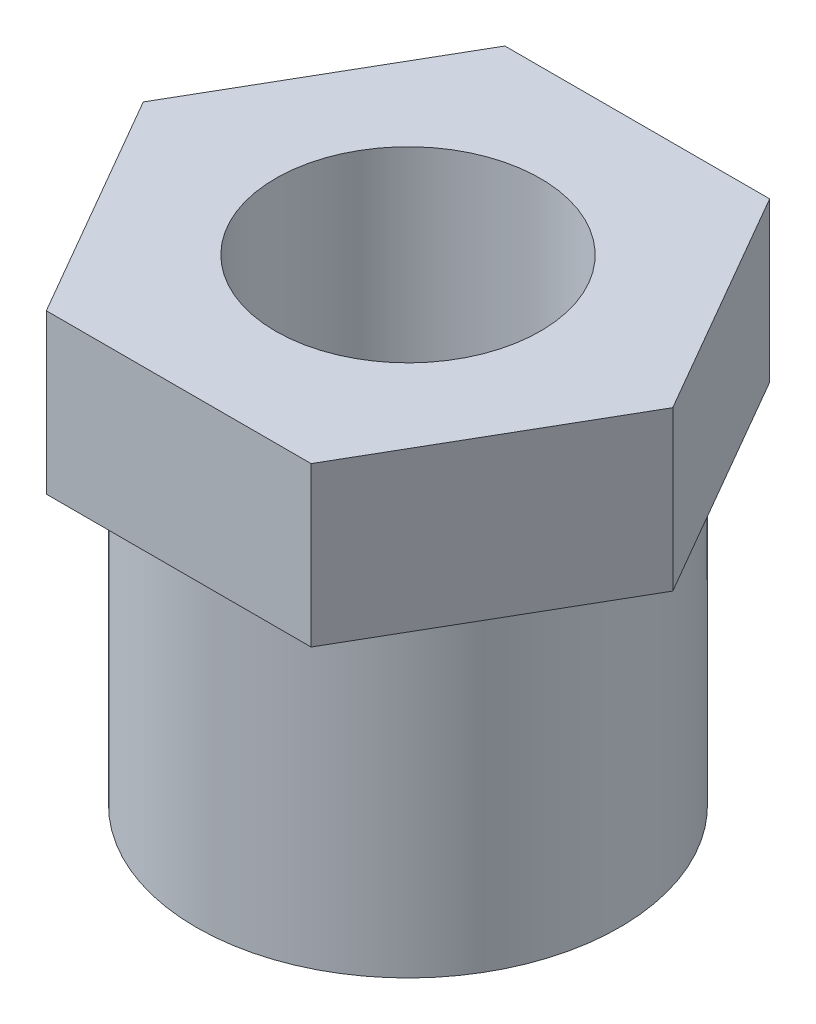
ISO-10303-21;
HEADER;
FILE_DESCRIPTION(('STEP AP214'),'2;1');
FILE_NAME('part.step','',(''),(''),'','','');
FILE_SCHEMA(('AUTOMOTIVE_DESIGN { 1 0 10303 214 1 1 1 1 }'));
ENDSEC;
DATA;
#1=APPLICATION_CONTEXT('core data for automotive mechanical design processes');
#2=APPLICATION_PROTOCOL_DEFINITION('international standard','automotive_design',2000,#1);
#3=PRODUCT_CONTEXT('',#1,'mechanical');
#4=PRODUCT('Part','Part','',(#3));
#5=PRODUCT_RELATED_PRODUCT_CATEGORY('part','',(#4));
#6=PRODUCT_DEFINITION_FORMATION('','',#4);
#7=PRODUCT_DEFINITION_CONTEXT('part definition',#1,'design');
#8=PRODUCT_DEFINITION('design','',#6,#7);
#9=PRODUCT_DEFINITION_SHAPE('','',#8);
#10=(LENGTH_UNIT() NAMED_UNIT(*) SI_UNIT(.MILLI.,.METRE.));
#11=(NAMED_UNIT(*) PLANE_ANGLE_UNIT() SI_UNIT($,.RADIAN.));
#12=(NAMED_UNIT(*) SI_UNIT($,.STERADIAN.) SOLID_ANGLE_UNIT());
#13=UNCERTAINTY_MEASURE_WITH_UNIT(LENGTH_MEASURE(1.E-05),#10,'distance_accuracy_value','');
#14=(GEOMETRIC_REPRESENTATION_CONTEXT(3) GLOBAL_UNCERTAINTY_ASSIGNED_CONTEXT((#13)) GLOBAL_UNIT_ASSIGNED_CONTEXT((#10,
#11,#12)) REPRESENTATION_CONTEXT('',''));
#15=CARTESIAN_POINT('',(0.,0.,0.));
#16=DIRECTION('',(0.,0.,1.));
#17=DIRECTION('',(1.,0.,0.));
#18=AXIS2_PLACEMENT_3D('',#15,#16,#17);
#19=CARTESIAN_POINT('',(0.,6.,0.));
#20=DIRECTION('',(0.,-1.,0.));
#21=DIRECTION('',(0.,0.,-1.));
#22=AXIS2_PLACEMENT_3D('',#19,#20,#21);
#23=CYLINDRICAL_SURFACE('',#22,4.);
#24=CARTESIAN_POINT('',(0.,6.,0.));
#25=DIRECTION('',(0.,1.,0.));
#26=DIRECTION('',(0.,0.,1.));
#27=AXIS2_PLACEMENT_3D('',#24,#25,#26);
#28=CIRCLE('',#27,4.);
#29=CARTESIAN_POINT('',(0.,6.,4.));
#30=VERTEX_POINT('',#29);
#31=EDGE_CURVE('E11',#30,#30,#28,.T.);
#32=ORIENTED_EDGE('',*,*,#31,.F.);
#33=EDGE_LOOP('',(#32));
#34=FACE_BOUND('',#33,.T.);
#35=CARTESIAN_POINT('',(0.,0.,0.));
#36=DIRECTION('',(0.,1.,0.));
#37=DIRECTION('',(0.,0.,1.));
#38=AXIS2_PLACEMENT_3D('',#35,#36,#37);
#39=CIRCLE('',#38,4.);
#40=CARTESIAN_POINT('',(0.,0.,4.));
#41=VERTEX_POINT('',#40);
#42=EDGE_CURVE('E40',#41,#41,#39,.T.);
#43=ORIENTED_EDGE('',*,*,#42,.T.);
#44=EDGE_LOOP('',(#43));
#45=FACE_BOUND('',#44,.T.);
#46=ADVANCED_FACE('F37',(#34,#45),#23,.T.);
#47=CARTESIAN_POINT('',(0.,0.,0.));
#48=DIRECTION('',(0.,1.,0.));
#49=DIRECTION('',(0.,0.,1.));
#50=AXIS2_PLACEMENT_3D('',#47,#48,#49);
#51=PLANE('',#50);
#52=CARTESIAN_POINT('',(0.,0.,0.));
#53=DIRECTION('',(0.,1.,0.));
#54=DIRECTION('',(0.,0.,1.));
#55=AXIS2_PLACEMENT_3D('',#52,#53,#54);
#56=CIRCLE('',#55,2.5);
#57=CARTESIAN_POINT('',(0.,0.,2.5));
#58=VERTEX_POINT('',#57);
#59=EDGE_CURVE('E126',#58,#58,#56,.T.);
#60=ORIENTED_EDGE('',*,*,#59,.T.);
#61=EDGE_LOOP('',(#60));
#62=FACE_BOUND('',#61,.T.);
#63=ORIENTED_EDGE('',*,*,#42,.F.);
#64=EDGE_LOOP('',(#63));
#65=FACE_BOUND('',#64,.T.);
#66=ADVANCED_FACE('F146',(#62,#65),#51,.F.);
#67=CARTESIAN_POINT('',(-2.5,9.,4.33012701892219));
#68=DIRECTION('',(0.,0.,-1.));
#69=DIRECTION('',(-1.,0.,0.));
#70=AXIS2_PLACEMENT_3D('',#67,#68,#69);
#71=PLANE('',#70);
#72=DIRECTION('',(1.,0.,0.));
#73=VECTOR('',#72,1.);
#74=CARTESIAN_POINT('',(-2.5,6.,4.33012701892219));
#75=LINE('',#74,#73);
#76=CARTESIAN_POINT('',(-2.5,6.,4.33012701892219));
#77=VERTEX_POINT('',#76);
#78=CARTESIAN_POINT('',(2.5,6.,4.33012701892219));
#79=VERTEX_POINT('',#78);
#80=EDGE_CURVE('E122',#77,#79,#75,.T.);
#81=ORIENTED_EDGE('',*,*,#80,.T.);
#82=DIRECTION('',(0.,-1.,0.));
#83=VECTOR('',#82,1.);
#84=CARTESIAN_POINT('',(2.5,9.,4.33012701892219));
#85=LINE('',#84,#83);
#86=CARTESIAN_POINT('',(2.5,9.,4.33012701892219));
#87=VERTEX_POINT('',#86);
#88=EDGE_CURVE('E140',#87,#79,#85,.T.);
#89=ORIENTED_EDGE('',*,*,#88,.F.);
#90=DIRECTION('',(1.,0.,0.));
#91=VECTOR('',#90,1.);
#92=CARTESIAN_POINT('',(-2.5,9.,4.33012701892219));
#93=LINE('',#92,#91);
#94=CARTESIAN_POINT('',(-2.5,9.,4.33012701892219));
#95=VERTEX_POINT('',#94);
#96=EDGE_CURVE('E133',#95,#87,#93,.T.);
#97=ORIENTED_EDGE('',*,*,#96,.F.);
#98=DIRECTION('',(0.,-1.,0.));
#99=VECTOR('',#98,1.);
#100=CARTESIAN_POINT('',(-2.5,9.,4.33012701892219));
#101=LINE('',#100,#99);
#102=EDGE_CURVE('E118',#95,#77,#101,.T.);
#103=ORIENTED_EDGE('',*,*,#102,.T.);
#104=EDGE_LOOP('',(#81,#89,#97,#103));
#105=FACE_BOUND('',#104,.T.);
#106=ADVANCED_FACE('F148',(#105),#71,.F.);
#107=CARTESIAN_POINT('',(2.5,9.,4.33012701892219));
#108=DIRECTION('',(-0.866025403784439,0.,-0.5));
#109=DIRECTION('',(-0.5,0.,0.866025403784439));
#110=AXIS2_PLACEMENT_3D('',#107,#108,#109);
#111=PLANE('',#110);
#112=DIRECTION('',(0.5,0.,-0.866025403784439));
#113=VECTOR('',#112,1.);
#114=CARTESIAN_POINT('',(2.5,6.,4.33012701892219));
#115=LINE('',#114,#113);
#116=CARTESIAN_POINT('',(5.,6.,0.));
#117=VERTEX_POINT('',#116);
#118=EDGE_CURVE('E125',#79,#117,#115,.T.);
#119=ORIENTED_EDGE('',*,*,#118,.T.);
#120=DIRECTION('',(0.,-1.,0.));
#121=VECTOR('',#120,1.);
#122=CARTESIAN_POINT('',(5.,9.,0.));
#123=LINE('',#122,#121);
#124=CARTESIAN_POINT('',(5.,9.,0.));
#125=VERTEX_POINT('',#124);
#126=EDGE_CURVE('E137',#125,#117,#123,.T.);
#127=ORIENTED_EDGE('',*,*,#126,.F.);
#128=DIRECTION('',(0.5,0.,-0.866025403784439));
#129=VECTOR('',#128,1.);
#130=CARTESIAN_POINT('',(2.5,9.,4.33012701892219));
#131=LINE('',#130,#129);
#132=EDGE_CURVE('E91',#87,#125,#131,.T.);
#133=ORIENTED_EDGE('',*,*,#132,.F.);
#134=ORIENTED_EDGE('',*,*,#88,.T.);
#135=EDGE_LOOP('',(#119,#127,#133,#134));
#136=FACE_BOUND('',#135,.T.);
#137=ADVANCED_FACE('F154',(#136),#111,.F.);
#138=CARTESIAN_POINT('',(5.,9.,0.));
#139=DIRECTION('',(-0.866025403784439,0.,0.5));
#140=DIRECTION('',(0.5,0.,0.866025403784439));
#141=AXIS2_PLACEMENT_3D('',#138,#139,#140);
#142=PLANE('',#141);
#143=DIRECTION('',(-0.5,0.,-0.866025403784438));
#144=VECTOR('',#143,1.);
#145=CARTESIAN_POINT('',(5.,6.,0.));
#146=LINE('',#145,#144);
#147=CARTESIAN_POINT('',(2.5,6.,-4.33012701892219));
#148=VERTEX_POINT('',#147);
#149=EDGE_CURVE('E128',#117,#148,#146,.T.);
#150=ORIENTED_EDGE('',*,*,#149,.T.);
#151=DIRECTION('',(0.,-1.,0.));
#152=VECTOR('',#151,1.);
#153=CARTESIAN_POINT('',(2.5,9.,-4.33012701892219));
#154=LINE('',#153,#152);
#155=CARTESIAN_POINT('',(2.5,9.,-4.33012701892219));
#156=VERTEX_POINT('',#155);
#157=EDGE_CURVE('E113',#156,#148,#154,.T.);
#158=ORIENTED_EDGE('',*,*,#157,.F.);
#159=DIRECTION('',(-0.5,0.,-0.866025403784438));
#160=VECTOR('',#159,1.);
#161=CARTESIAN_POINT('',(5.,9.,0.));
#162=LINE('',#161,#160);
#163=EDGE_CURVE('E104',#125,#156,#162,.T.);
#164=ORIENTED_EDGE('',*,*,#163,.F.);
#165=ORIENTED_EDGE('',*,*,#126,.T.);
#166=EDGE_LOOP('',(#150,#158,#164,#165));
#167=FACE_BOUND('',#166,.T.);
#168=ADVANCED_FACE('F162',(#167),#142,.F.);
#169=CARTESIAN_POINT('',(2.5,9.,-4.33012701892219));
#170=DIRECTION('',(0.,0.,1.));
#171=DIRECTION('',(1.,0.,0.));
#172=AXIS2_PLACEMENT_3D('',#169,#170,#171);
#173=PLANE('',#172);
#174=DIRECTION('',(-1.,0.,0.));
#175=VECTOR('',#174,1.);
#176=CARTESIAN_POINT('',(2.5,6.,-4.33012701892219));
#177=LINE('',#176,#175);
#178=CARTESIAN_POINT('',(-2.5,6.,-4.33012701892219));
#179=VERTEX_POINT('',#178);
#180=EDGE_CURVE('E112',#148,#179,#177,.T.);
#181=ORIENTED_EDGE('',*,*,#180,.T.);
#182=DIRECTION('',(0.,-1.,0.));
#183=VECTOR('',#182,1.);
#184=CARTESIAN_POINT('',(-2.5,9.,-4.33012701892219));
#185=LINE('',#184,#183);
#186=CARTESIAN_POINT('',(-2.5,9.,-4.33012701892219));
#187=VERTEX_POINT('',#186);
#188=EDGE_CURVE('E109',#187,#179,#185,.T.);
#189=ORIENTED_EDGE('',*,*,#188,.F.);
#190=DIRECTION('',(-1.,0.,0.));
#191=VECTOR('',#190,1.);
#192=CARTESIAN_POINT('',(2.5,9.,-4.33012701892219));
#193=LINE('',#192,#191);
#194=EDGE_CURVE('E98',#156,#187,#193,.T.);
#195=ORIENTED_EDGE('',*,*,#194,.F.);
#196=ORIENTED_EDGE('',*,*,#157,.T.);
#197=EDGE_LOOP('',(#181,#189,#195,#196));
#198=FACE_BOUND('',#197,.T.);
#199=ADVANCED_FACE('F110',(#198),#173,.F.);
#200=CARTESIAN_POINT('',(-2.5,9.,-4.33012701892219));
#201=DIRECTION('',(0.866025403784438,0.,0.5));
#202=DIRECTION('',(0.5,0.,-0.866025403784439));
#203=AXIS2_PLACEMENT_3D('',#200,#201,#202);
#204=PLANE('',#203);
#205=DIRECTION('',(-0.5,0.,0.866025403784439));
#206=VECTOR('',#205,1.);
#207=CARTESIAN_POINT('',(-2.5,6.,-4.33012701892219));
#208=LINE('',#207,#206);
#209=CARTESIAN_POINT('',(-5.,6.,0.));
#210=VERTEX_POINT('',#209);
#211=EDGE_CURVE('E76',#179,#210,#208,.T.);
#212=ORIENTED_EDGE('',*,*,#211,.T.);
#213=DIRECTION('',(0.,-1.,0.));
#214=VECTOR('',#213,1.);
#215=CARTESIAN_POINT('',(-5.,9.,0.));
#216=LINE('',#215,#214);
#217=CARTESIAN_POINT('',(-5.,9.,0.));
#218=VERTEX_POINT('',#217);
#219=EDGE_CURVE('E114',#218,#210,#216,.T.);
#220=ORIENTED_EDGE('',*,*,#219,.F.);
#221=DIRECTION('',(-0.5,0.,0.866025403784439));
#222=VECTOR('',#221,1.);
#223=CARTESIAN_POINT('',(-2.5,9.,-4.33012701892219));
#224=LINE('',#223,#222);
#225=EDGE_CURVE('E102',#187,#218,#224,.T.);
#226=ORIENTED_EDGE('',*,*,#225,.F.);
#227=ORIENTED_EDGE('',*,*,#188,.T.);
#228=EDGE_LOOP('',(#212,#220,#226,#227));
#229=FACE_BOUND('',#228,.T.);
#230=ADVANCED_FACE('F116',(#229),#204,.F.);
#231=CARTESIAN_POINT('',(-5.,9.,0.));
#232=DIRECTION('',(0.866025403784438,0.,-0.500000000000001));
#233=DIRECTION('',(-0.500000000000001,0.,-0.866025403784438));
#234=AXIS2_PLACEMENT_3D('',#231,#232,#233);
#235=PLANE('',#234);
#236=DIRECTION('',(0.5,0.,0.866025403784438));
#237=VECTOR('',#236,1.);
#238=CARTESIAN_POINT('',(-5.,6.,0.));
#239=LINE('',#238,#237);
#240=EDGE_CURVE('E82',#210,#77,#239,.T.);
#241=ORIENTED_EDGE('',*,*,#240,.T.);
#242=ORIENTED_EDGE('',*,*,#102,.F.);
#243=DIRECTION('',(0.5,0.,0.866025403784438));
#244=VECTOR('',#243,1.);
#245=CARTESIAN_POINT('',(-5.,9.,0.));
#246=LINE('',#245,#244);
#247=EDGE_CURVE('E53',#218,#95,#246,.T.);
#248=ORIENTED_EDGE('',*,*,#247,.F.);
#249=ORIENTED_EDGE('',*,*,#219,.T.);
#250=EDGE_LOOP('',(#241,#242,#248,#249));
#251=FACE_BOUND('',#250,.T.);
#252=ADVANCED_FACE('F170',(#251),#235,.F.);
#253=CARTESIAN_POINT('',(0.,9.,0.));
#254=DIRECTION('',(0.,1.,0.));
#255=DIRECTION('',(0.,0.,1.));
#256=AXIS2_PLACEMENT_3D('',#253,#254,#255);
#257=PLANE('',#256);
#258=CARTESIAN_POINT('',(0.,9.,0.));
#259=DIRECTION('',(0.,1.,0.));
#260=DIRECTION('',(0.,0.,1.));
#261=AXIS2_PLACEMENT_3D('',#258,#259,#260);
#262=CIRCLE('',#261,2.5);
#263=CARTESIAN_POINT('',(0.,9.,2.5));
#264=VERTEX_POINT('',#263);
#265=EDGE_CURVE('E189',#264,#264,#262,.T.);
#266=ORIENTED_EDGE('',*,*,#265,.F.);
#267=EDGE_LOOP('',(#266));
#268=FACE_BOUND('',#267,.T.);
#269=ORIENTED_EDGE('',*,*,#96,.T.);
#270=ORIENTED_EDGE('',*,*,#132,.T.);
#271=ORIENTED_EDGE('',*,*,#163,.T.);
#272=ORIENTED_EDGE('',*,*,#194,.T.);
#273=ORIENTED_EDGE('',*,*,#225,.T.);
#274=ORIENTED_EDGE('',*,*,#247,.T.);
#275=EDGE_LOOP('',(#269,#270,#271,#272,#273,#274));
#276=FACE_BOUND('',#275,.T.);
#277=ADVANCED_FACE('F100',(#268,#276),#257,.T.);
#278=CARTESIAN_POINT('',(0.,6.,0.));
#279=DIRECTION('',(0.,1.,0.));
#280=DIRECTION('',(0.,0.,1.));
#281=AXIS2_PLACEMENT_3D('',#278,#279,#280);
#282=PLANE('',#281);
#283=ORIENTED_EDGE('',*,*,#31,.T.);
#284=EDGE_LOOP('',(#283));
#285=FACE_BOUND('',#284,.T.);
#286=ORIENTED_EDGE('',*,*,#80,.F.);
#287=ORIENTED_EDGE('',*,*,#240,.F.);
#288=ORIENTED_EDGE('',*,*,#211,.F.);
#289=ORIENTED_EDGE('',*,*,#180,.F.);
#290=ORIENTED_EDGE('',*,*,#149,.F.);
#291=ORIENTED_EDGE('',*,*,#118,.F.);
#292=EDGE_LOOP('',(#286,#287,#288,#289,#290,#291));
#293=FACE_BOUND('',#292,.T.);
#294=ADVANCED_FACE('F173',(#285,#293),#282,.F.);
#295=CARTESIAN_POINT('',(0.,0.,0.));
#296=DIRECTION('',(0.,1.,0.));
#297=DIRECTION('',(0.,0.,1.));
#298=AXIS2_PLACEMENT_3D('',#295,#296,#297);
#299=CYLINDRICAL_SURFACE('',#298,2.5);
#300=ORIENTED_EDGE('',*,*,#59,.F.);
#301=EDGE_LOOP('',(#300));
#302=FACE_BOUND('',#301,.T.);
#303=ORIENTED_EDGE('',*,*,#265,.T.);
#304=EDGE_LOOP('',(#303));
#305=FACE_BOUND('',#304,.T.);
#306=ADVANCED_FACE('F176',(#302,#305),#299,.F.);
#307=CLOSED_SHELL('',(#46,#66,#106,#137,#168,#199,#230,#252,#277,#294,#306));
#308=MANIFOLD_SOLID_BREP('B2',#307);
#309=ADVANCED_BREP_SHAPE_REPRESENTATION('',(#18,#308),#14);
#310=SHAPE_DEFINITION_REPRESENTATION(#9,#309);
ENDSEC;
END-ISO-10303-21;
